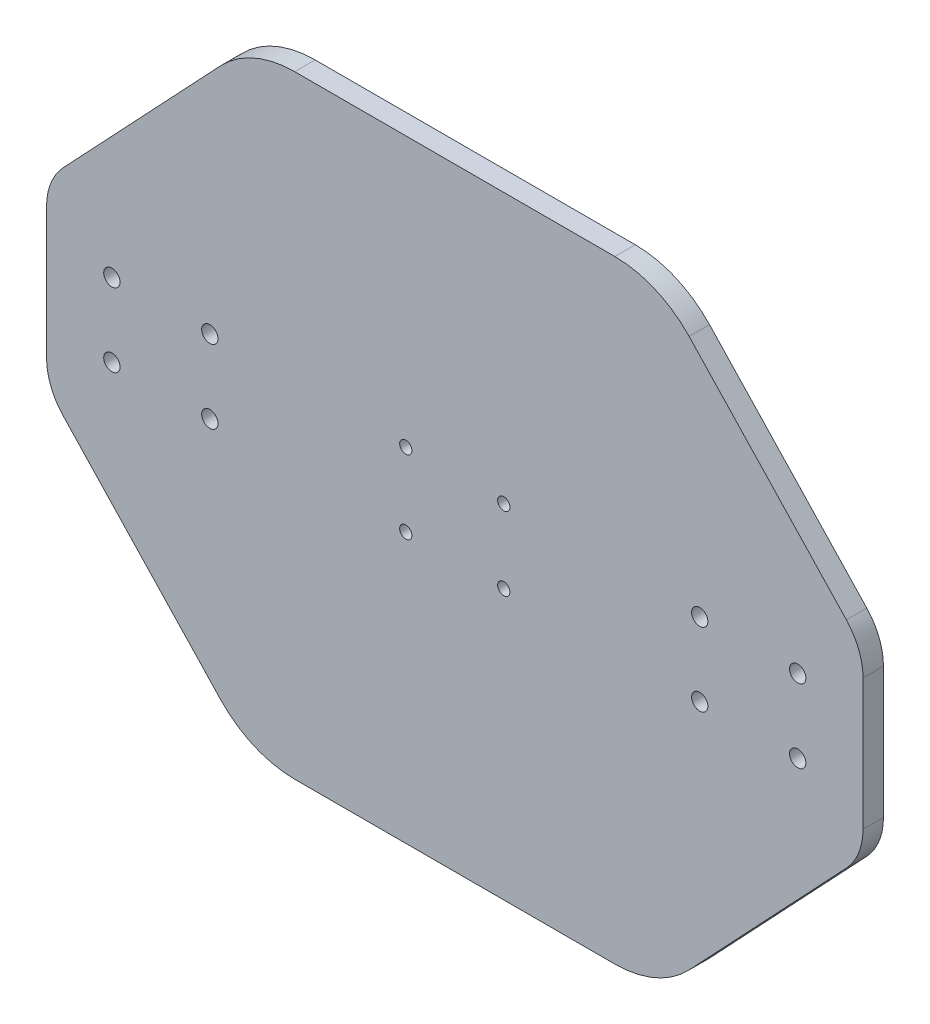
ISO-10303-21;
HEADER;
FILE_DESCRIPTION(('STEP AP214'),'2;1');
FILE_NAME('part.step','',(''),(''),'','','');
FILE_SCHEMA(('AUTOMOTIVE_DESIGN { 1 0 10303 214 1 1 1 1 }'));
ENDSEC;
DATA;
#1=APPLICATION_CONTEXT('core data for automotive mechanical design processes');
#2=APPLICATION_PROTOCOL_DEFINITION('international standard','automotive_design',2000,#1);
#3=PRODUCT_CONTEXT('',#1,'mechanical');
#4=PRODUCT('Part','Part','',(#3));
#5=PRODUCT_RELATED_PRODUCT_CATEGORY('part','',(#4));
#6=PRODUCT_DEFINITION_FORMATION('','',#4);
#7=PRODUCT_DEFINITION_CONTEXT('part definition',#1,'design');
#8=PRODUCT_DEFINITION('design','',#6,#7);
#9=PRODUCT_DEFINITION_SHAPE('','',#8);
#10=(LENGTH_UNIT() NAMED_UNIT(*) SI_UNIT(.MILLI.,.METRE.));
#11=(NAMED_UNIT(*) PLANE_ANGLE_UNIT() SI_UNIT($,.RADIAN.));
#12=(NAMED_UNIT(*) SI_UNIT($,.STERADIAN.) SOLID_ANGLE_UNIT());
#13=UNCERTAINTY_MEASURE_WITH_UNIT(LENGTH_MEASURE(1.E-05),#10,'distance_accuracy_value','');
#14=(GEOMETRIC_REPRESENTATION_CONTEXT(3) GLOBAL_UNCERTAINTY_ASSIGNED_CONTEXT((#13)) GLOBAL_UNIT_ASSIGNED_CONTEXT((#10,
#11,#12)) REPRESENTATION_CONTEXT('',''));
#15=CARTESIAN_POINT('',(0.,0.,0.));
#16=DIRECTION('',(0.,0.,1.));
#17=DIRECTION('',(1.,0.,0.));
#18=AXIS2_PLACEMENT_3D('',#15,#16,#17);
#19=CARTESIAN_POINT('',(200.,-69.40115510375,5.));
#20=DIRECTION('',(-1.,0.,0.));
#21=DIRECTION('',(0.,0.,1.));
#22=AXIS2_PLACEMENT_3D('',#19,#20,#21);
#23=PLANE('',#22);
#24=DIRECTION('',(0.,0.,-1.));
#25=VECTOR('',#24,1.);
#26=CARTESIAN_POINT('',(200.,-10.3963762982842,400.));
#27=LINE('',#26,#25);
#28=CARTESIAN_POINT('',(200.,-10.3963762982842,5.));
#29=VERTEX_POINT('',#28);
#30=CARTESIAN_POINT('',(200.,-10.3963762982842,0.));
#31=VERTEX_POINT('',#30);
#32=EDGE_CURVE('E212',#29,#31,#27,.T.);
#33=ORIENTED_EDGE('',*,*,#32,.T.);
#34=DIRECTION('',(0.,1.,0.));
#35=VECTOR('',#34,1.);
#36=CARTESIAN_POINT('',(200.,-69.40115510375,0.));
#37=LINE('',#36,#35);
#38=CARTESIAN_POINT('',(200.,21.6940660907842,0.));
#39=VERTEX_POINT('',#38);
#40=EDGE_CURVE('E310',#31,#39,#37,.T.);
#41=ORIENTED_EDGE('',*,*,#40,.T.);
#42=DIRECTION('',(0.,0.,-1.));
#43=VECTOR('',#42,1.);
#44=CARTESIAN_POINT('',(200.,21.6940660907842,400.));
#45=LINE('',#44,#43);
#46=CARTESIAN_POINT('',(200.,21.6940660907842,5.));
#47=VERTEX_POINT('',#46);
#48=EDGE_CURVE('E229',#47,#39,#45,.T.);
#49=ORIENTED_EDGE('',*,*,#48,.F.);
#50=DIRECTION('',(0.,1.,0.));
#51=VECTOR('',#50,1.);
#52=CARTESIAN_POINT('',(200.,-69.40115510375,5.));
#53=LINE('',#52,#51);
#54=EDGE_CURVE('E301',#29,#47,#53,.T.);
#55=ORIENTED_EDGE('',*,*,#54,.F.);
#56=EDGE_LOOP('',(#33,#41,#49,#55));
#57=FACE_BOUND('',#56,.T.);
#58=ADVANCED_FACE('F38',(#57),#23,.F.);
#59=CARTESIAN_POINT('',(200.,80.69884489625,5.));
#60=DIRECTION('',(0.,-1.,0.));
#61=DIRECTION('',(0.,0.,-1.));
#62=AXIS2_PLACEMENT_3D('',#59,#60,#61);
#63=PLANE('',#62);
#64=DIRECTION('',(0.,0.,-1.));
#65=VECTOR('',#64,1.);
#66=CARTESIAN_POINT('',(60.7913584754412,80.69884489625,400.));
#67=LINE('',#66,#65);
#68=CARTESIAN_POINT('',(60.7913584754412,80.69884489625,5.));
#69=VERTEX_POINT('',#68);
#70=CARTESIAN_POINT('',(60.7913584754412,80.69884489625,0.));
#71=VERTEX_POINT('',#70);
#72=EDGE_CURVE('E185',#69,#71,#67,.T.);
#73=ORIENTED_EDGE('',*,*,#72,.F.);
#74=DIRECTION('',(-1.,0.,0.));
#75=VECTOR('',#74,1.);
#76=CARTESIAN_POINT('',(200.,80.69884489625,5.));
#77=LINE('',#76,#75);
#78=CARTESIAN_POINT('',(139.208641524559,80.69884489625,5.));
#79=VERTEX_POINT('',#78);
#80=EDGE_CURVE('E304',#79,#69,#77,.T.);
#81=ORIENTED_EDGE('',*,*,#80,.F.);
#82=DIRECTION('',(0.,0.,-1.));
#83=VECTOR('',#82,1.);
#84=CARTESIAN_POINT('',(139.208641524559,80.69884489625,400.));
#85=LINE('',#84,#83);
#86=CARTESIAN_POINT('',(139.208641524559,80.69884489625,0.));
#87=VERTEX_POINT('',#86);
#88=EDGE_CURVE('E231',#79,#87,#85,.T.);
#89=ORIENTED_EDGE('',*,*,#88,.T.);
#90=DIRECTION('',(-1.,0.,0.));
#91=VECTOR('',#90,1.);
#92=CARTESIAN_POINT('',(200.,80.69884489625,0.));
#93=LINE('',#92,#91);
#94=EDGE_CURVE('E313',#87,#71,#93,.T.);
#95=ORIENTED_EDGE('',*,*,#94,.T.);
#96=EDGE_LOOP('',(#73,#81,#89,#95));
#97=FACE_BOUND('',#96,.T.);
#98=ADVANCED_FACE('F372',(#97),#63,.F.);
#99=CARTESIAN_POINT('',(0.,-69.40115510375,5.));
#100=DIRECTION('',(1.,0.,0.));
#101=DIRECTION('',(0.,0.,-1.));
#102=AXIS2_PLACEMENT_3D('',#99,#100,#101);
#103=PLANE('',#102);
#104=DIRECTION('',(0.,0.,-1.));
#105=VECTOR('',#104,1.);
#106=CARTESIAN_POINT('',(0.,-10.3963762982842,400.));
#107=LINE('',#106,#105);
#108=CARTESIAN_POINT('',(0.,-10.3963762982842,5.));
#109=VERTEX_POINT('',#108);
#110=CARTESIAN_POINT('',(0.,-10.3963762982842,0.));
#111=VERTEX_POINT('',#110);
#112=EDGE_CURVE('E198',#109,#111,#107,.T.);
#113=ORIENTED_EDGE('',*,*,#112,.F.);
#114=DIRECTION('',(0.,-1.,0.));
#115=VECTOR('',#114,1.);
#116=CARTESIAN_POINT('',(0.,-69.40115510375,5.));
#117=LINE('',#116,#115);
#118=CARTESIAN_POINT('',(0.,21.6940660907842,5.));
#119=VERTEX_POINT('',#118);
#120=EDGE_CURVE('E46',#119,#109,#117,.T.);
#121=ORIENTED_EDGE('',*,*,#120,.F.);
#122=DIRECTION('',(0.,0.,-1.));
#123=VECTOR('',#122,1.);
#124=CARTESIAN_POINT('',(0.,21.6940660907842,400.));
#125=LINE('',#124,#123);
#126=CARTESIAN_POINT('',(0.,21.6940660907842,0.));
#127=VERTEX_POINT('',#126);
#128=EDGE_CURVE('E163',#119,#127,#125,.T.);
#129=ORIENTED_EDGE('',*,*,#128,.T.);
#130=DIRECTION('',(0.,-1.,0.));
#131=VECTOR('',#130,1.);
#132=CARTESIAN_POINT('',(0.,-69.40115510375,0.));
#133=LINE('',#132,#131);
#134=EDGE_CURVE('E180',#127,#111,#133,.T.);
#135=ORIENTED_EDGE('',*,*,#134,.T.);
#136=EDGE_LOOP('',(#113,#121,#129,#135));
#137=FACE_BOUND('',#136,.T.);
#138=ADVANCED_FACE('F377',(#137),#103,.F.);
#139=CARTESIAN_POINT('',(200.,-69.40115510375,5.));
#140=DIRECTION('',(0.,1.,0.));
#141=DIRECTION('',(0.,0.,1.));
#142=AXIS2_PLACEMENT_3D('',#139,#140,#141);
#143=PLANE('',#142);
#144=DIRECTION('',(0.,0.,-1.));
#145=VECTOR('',#144,1.);
#146=CARTESIAN_POINT('',(139.208641524559,-69.40115510375,400.));
#147=LINE('',#146,#145);
#148=CARTESIAN_POINT('',(139.208641524559,-69.40115510375,5.));
#149=VERTEX_POINT('',#148);
#150=CARTESIAN_POINT('',(139.208641524559,-69.40115510375,0.));
#151=VERTEX_POINT('',#150);
#152=EDGE_CURVE('E191',#149,#151,#147,.T.);
#153=ORIENTED_EDGE('',*,*,#152,.F.);
#154=DIRECTION('',(1.,0.,0.));
#155=VECTOR('',#154,1.);
#156=CARTESIAN_POINT('',(200.,-69.40115510375,5.));
#157=LINE('',#156,#155);
#158=CARTESIAN_POINT('',(60.791358475441,-69.40115510375,5.));
#159=VERTEX_POINT('',#158);
#160=EDGE_CURVE('E12',#159,#149,#157,.T.);
#161=ORIENTED_EDGE('',*,*,#160,.F.);
#162=DIRECTION('',(0.,0.,-1.));
#163=VECTOR('',#162,1.);
#164=CARTESIAN_POINT('',(60.791358475441,-69.40115510375,400.));
#165=LINE('',#164,#163);
#166=CARTESIAN_POINT('',(60.791358475441,-69.40115510375,0.));
#167=VERTEX_POINT('',#166);
#168=EDGE_CURVE('E200',#159,#167,#165,.T.);
#169=ORIENTED_EDGE('',*,*,#168,.T.);
#170=DIRECTION('',(1.,0.,0.));
#171=VECTOR('',#170,1.);
#172=CARTESIAN_POINT('',(200.,-69.40115510375,0.));
#173=LINE('',#172,#171);
#174=EDGE_CURVE('E305',#167,#151,#173,.T.);
#175=ORIENTED_EDGE('',*,*,#174,.T.);
#176=EDGE_LOOP('',(#153,#161,#169,#175));
#177=FACE_BOUND('',#176,.T.);
#178=ADVANCED_FACE('F401',(#177),#143,.F.);
#179=CARTESIAN_POINT('',(0.,0.,5.));
#180=DIRECTION('',(0.,0.,1.));
#181=DIRECTION('',(1.,0.,0.));
#182=AXIS2_PLACEMENT_3D('',#179,#180,#181);
#183=PLANE('',#182);
#184=CARTESIAN_POINT('',(40.,14.64884489625,5.));
#185=DIRECTION('',(0.,0.,1.));
#186=DIRECTION('',(-1.,0.,0.));
#187=AXIS2_PLACEMENT_3D('',#184,#185,#186);
#188=CIRCLE('',#187,2.);
#189=CARTESIAN_POINT('',(38.,14.64884489625,5.));
#190=VERTEX_POINT('',#189);
#191=EDGE_CURVE('E280',#190,#190,#188,.T.);
#192=ORIENTED_EDGE('',*,*,#191,.F.);
#193=EDGE_LOOP('',(#192));
#194=FACE_BOUND('',#193,.T.);
#195=CARTESIAN_POINT('',(40.,-3.35115510374999,5.));
#196=DIRECTION('',(0.,0.,1.));
#197=DIRECTION('',(1.,0.,0.));
#198=AXIS2_PLACEMENT_3D('',#195,#196,#197);
#199=CIRCLE('',#198,2.);
#200=CARTESIAN_POINT('',(42.,-3.35115510374999,5.));
#201=VERTEX_POINT('',#200);
#202=EDGE_CURVE('E277',#201,#201,#199,.T.);
#203=ORIENTED_EDGE('',*,*,#202,.F.);
#204=EDGE_LOOP('',(#203));
#205=FACE_BOUND('',#204,.T.);
#206=CARTESIAN_POINT('',(16.,-3.35115510374999,5.));
#207=DIRECTION('',(0.,0.,1.));
#208=DIRECTION('',(-1.,0.,0.));
#209=AXIS2_PLACEMENT_3D('',#206,#207,#208);
#210=CIRCLE('',#209,2.);
#211=CARTESIAN_POINT('',(14.,-3.35115510374999,5.));
#212=VERTEX_POINT('',#211);
#213=EDGE_CURVE('E274',#212,#212,#210,.T.);
#214=ORIENTED_EDGE('',*,*,#213,.F.);
#215=EDGE_LOOP('',(#214));
#216=FACE_BOUND('',#215,.T.);
#217=CARTESIAN_POINT('',(184.,-3.35115510374997,5.));
#218=DIRECTION('',(0.,0.,1.));
#219=DIRECTION('',(1.,0.,0.));
#220=AXIS2_PLACEMENT_3D('',#217,#218,#219);
#221=CIRCLE('',#220,2.);
#222=CARTESIAN_POINT('',(186.,-3.35115510374997,5.));
#223=VERTEX_POINT('',#222);
#224=EDGE_CURVE('E268',#223,#223,#221,.T.);
#225=ORIENTED_EDGE('',*,*,#224,.F.);
#226=EDGE_LOOP('',(#225));
#227=FACE_BOUND('',#226,.T.);
#228=CARTESIAN_POINT('',(112.,-3.35115510374998,5.));
#229=DIRECTION('',(0.,0.,1.));
#230=DIRECTION('',(1.,0.,0.));
#231=AXIS2_PLACEMENT_3D('',#228,#229,#230);
#232=CIRCLE('',#231,1.5);
#233=CARTESIAN_POINT('',(113.5,-3.35115510374998,5.));
#234=VERTEX_POINT('',#233);
#235=EDGE_CURVE('E283',#234,#234,#232,.T.);
#236=ORIENTED_EDGE('',*,*,#235,.F.);
#237=EDGE_LOOP('',(#236));
#238=FACE_BOUND('',#237,.T.);
#239=CARTESIAN_POINT('',(88.,-3.35115510374998,5.));
#240=DIRECTION('',(0.,0.,1.));
#241=DIRECTION('',(-1.,0.,0.));
#242=AXIS2_PLACEMENT_3D('',#239,#240,#241);
#243=CIRCLE('',#242,1.5);
#244=CARTESIAN_POINT('',(86.5,-3.35115510374998,5.));
#245=VERTEX_POINT('',#244);
#246=EDGE_CURVE('E293',#245,#245,#243,.T.);
#247=ORIENTED_EDGE('',*,*,#246,.F.);
#248=EDGE_LOOP('',(#247));
#249=FACE_BOUND('',#248,.T.);
#250=CARTESIAN_POINT('',(112.,14.64884489625,5.));
#251=DIRECTION('',(0.,0.,1.));
#252=DIRECTION('',(-1.,0.,0.));
#253=AXIS2_PLACEMENT_3D('',#250,#251,#252);
#254=CIRCLE('',#253,1.5);
#255=CARTESIAN_POINT('',(110.5,14.64884489625,5.));
#256=VERTEX_POINT('',#255);
#257=EDGE_CURVE('E290',#256,#256,#254,.T.);
#258=ORIENTED_EDGE('',*,*,#257,.F.);
#259=EDGE_LOOP('',(#258));
#260=FACE_BOUND('',#259,.T.);
#261=CARTESIAN_POINT('',(16.,14.64884489625,5.));
#262=DIRECTION('',(0.,0.,1.));
#263=DIRECTION('',(1.,0.,0.));
#264=AXIS2_PLACEMENT_3D('',#261,#262,#263);
#265=CIRCLE('',#264,2.);
#266=CARTESIAN_POINT('',(18.,14.64884489625,5.));
#267=VERTEX_POINT('',#266);
#268=EDGE_CURVE('E286',#267,#267,#265,.T.);
#269=ORIENTED_EDGE('',*,*,#268,.F.);
#270=EDGE_LOOP('',(#269));
#271=FACE_BOUND('',#270,.T.);
#272=CARTESIAN_POINT('',(160.,-3.35115510374998,5.));
#273=DIRECTION('',(0.,0.,1.));
#274=DIRECTION('',(-1.,0.,0.));
#275=AXIS2_PLACEMENT_3D('',#272,#273,#274);
#276=CIRCLE('',#275,2.);
#277=CARTESIAN_POINT('',(158.,-3.35115510374998,5.));
#278=VERTEX_POINT('',#277);
#279=EDGE_CURVE('E265',#278,#278,#276,.T.);
#280=ORIENTED_EDGE('',*,*,#279,.F.);
#281=EDGE_LOOP('',(#280));
#282=FACE_BOUND('',#281,.T.);
#283=CARTESIAN_POINT('',(160.,14.64884489625,5.));
#284=DIRECTION('',(0.,0.,1.));
#285=DIRECTION('',(1.,0.,0.));
#286=AXIS2_PLACEMENT_3D('',#283,#284,#285);
#287=CIRCLE('',#286,2.);
#288=CARTESIAN_POINT('',(162.,14.64884489625,5.));
#289=VERTEX_POINT('',#288);
#290=EDGE_CURVE('E269',#289,#289,#287,.T.);
#291=ORIENTED_EDGE('',*,*,#290,.F.);
#292=EDGE_LOOP('',(#291));
#293=FACE_BOUND('',#292,.T.);
#294=CARTESIAN_POINT('',(184.,14.64884489625,5.));
#295=DIRECTION('',(0.,0.,1.));
#296=DIRECTION('',(-1.,0.,0.));
#297=AXIS2_PLACEMENT_3D('',#294,#295,#296);
#298=CIRCLE('',#297,2.);
#299=CARTESIAN_POINT('',(182.,14.64884489625,5.));
#300=VERTEX_POINT('',#299);
#301=EDGE_CURVE('E264',#300,#300,#298,.T.);
#302=ORIENTED_EDGE('',*,*,#301,.F.);
#303=EDGE_LOOP('',(#302));
#304=FACE_BOUND('',#303,.T.);
#305=CARTESIAN_POINT('',(88.,14.64884489625,5.));
#306=DIRECTION('',(0.,0.,1.));
#307=DIRECTION('',(1.,0.,0.));
#308=AXIS2_PLACEMENT_3D('',#305,#306,#307);
#309=CIRCLE('',#308,1.5);
#310=CARTESIAN_POINT('',(89.5,14.64884489625,5.));
#311=VERTEX_POINT('',#310);
#312=EDGE_CURVE('E289',#311,#311,#309,.T.);
#313=ORIENTED_EDGE('',*,*,#312,.F.);
#314=EDGE_LOOP('',(#313));
#315=FACE_BOUND('',#314,.T.);
#316=ORIENTED_EDGE('',*,*,#160,.T.);
#317=CARTESIAN_POINT('',(139.208641524559,-44.40115510375,5.));
#318=DIRECTION('',(0.,0.,1.));
#319=DIRECTION('',(1.,0.,0.));
#320=AXIS2_PLACEMENT_3D('',#317,#318,#319);
#321=CIRCLE('',#320,25.);
#322=CARTESIAN_POINT('',(157.401555295619,-61.5481049350979,5.));
#323=VERTEX_POINT('',#322);
#324=EDGE_CURVE('E261',#149,#323,#321,.T.);
#325=ORIENTED_EDGE('',*,*,#324,.T.);
#326=DIRECTION('',(-0.685877993253921,-0.72771655084241,0.));
#327=VECTOR('',#326,1.);
#328=CARTESIAN_POINT('',(114.075542164319,-107.517004867407,5.));
#329=LINE('',#328,#327);
#330=CARTESIAN_POINT('',(195.915748262636,-20.6845461970931,5.));
#331=VERTEX_POINT('',#330);
#332=EDGE_CURVE('E257',#331,#323,#329,.T.);
#333=ORIENTED_EDGE('',*,*,#332,.F.);
#334=CARTESIAN_POINT('',(185.,-10.3963762982842,5.));
#335=DIRECTION('',(0.,0.,1.));
#336=DIRECTION('',(1.,0.,0.));
#337=AXIS2_PLACEMENT_3D('',#334,#335,#336);
#338=CIRCLE('',#337,15.);
#339=EDGE_CURVE('E259',#29,#331,#338,.F.);
#340=ORIENTED_EDGE('',*,*,#339,.F.);
#341=ORIENTED_EDGE('',*,*,#54,.T.);
#342=CARTESIAN_POINT('',(185.,21.6940660907842,5.));
#343=DIRECTION('',(0.,0.,1.));
#344=DIRECTION('',(1.,0.,0.));
#345=AXIS2_PLACEMENT_3D('',#342,#343,#344);
#346=CIRCLE('',#345,15.);
#347=CARTESIAN_POINT('',(195.915748262636,31.9822359895931,5.));
#348=VERTEX_POINT('',#347);
#349=EDGE_CURVE('E237',#47,#348,#346,.T.);
#350=ORIENTED_EDGE('',*,*,#349,.T.);
#351=DIRECTION('',(-0.685877993253921,0.72771655084241,0.));
#352=VECTOR('',#351,1.);
#353=CARTESIAN_POINT('',(119.714498955847,112.831761504097,5.));
#354=LINE('',#353,#352);
#355=CARTESIAN_POINT('',(157.401555295619,72.8457947275979,5.));
#356=VERTEX_POINT('',#355);
#357=EDGE_CURVE('E240',#348,#356,#354,.T.);
#358=ORIENTED_EDGE('',*,*,#357,.T.);
#359=CARTESIAN_POINT('',(139.208641524559,55.69884489625,5.));
#360=DIRECTION('',(0.,0.,1.));
#361=DIRECTION('',(1.,0.,0.));
#362=AXIS2_PLACEMENT_3D('',#359,#360,#361);
#363=CIRCLE('',#362,25.);
#364=EDGE_CURVE('E228',#79,#356,#363,.F.);
#365=ORIENTED_EDGE('',*,*,#364,.F.);
#366=ORIENTED_EDGE('',*,*,#80,.T.);
#367=CARTESIAN_POINT('',(60.791358475441,55.69884489625,5.));
#368=DIRECTION('',(0.,0.,1.));
#369=DIRECTION('',(1.,0.,0.));
#370=AXIS2_PLACEMENT_3D('',#367,#368,#369);
#371=CIRCLE('',#370,25.);
#372=CARTESIAN_POINT('',(42.5984447043807,72.8457947275979,5.));
#373=VERTEX_POINT('',#372);
#374=EDGE_CURVE('E246',#69,#373,#371,.T.);
#375=ORIENTED_EDGE('',*,*,#374,.T.);
#376=DIRECTION('',(0.685877993253921,0.72771655084241,0.));
#377=VECTOR('',#376,1.);
#378=CARTESIAN_POINT('',(-13.8002232818518,13.0068079942053,5.));
#379=LINE('',#378,#377);
#380=CARTESIAN_POINT('',(4.08425173736389,31.9822359895931,5.));
#381=VERTEX_POINT('',#380);
#382=EDGE_CURVE('E243',#381,#373,#379,.T.);
#383=ORIENTED_EDGE('',*,*,#382,.F.);
#384=CARTESIAN_POINT('',(15.,21.6940660907842,5.));
#385=DIRECTION('',(0.,0.,1.));
#386=DIRECTION('',(1.,0.,0.));
#387=AXIS2_PLACEMENT_3D('',#384,#385,#386);
#388=CIRCLE('',#387,15.);
#389=EDGE_CURVE('E160',#119,#381,#388,.F.);
#390=ORIENTED_EDGE('',*,*,#389,.F.);
#391=ORIENTED_EDGE('',*,*,#120,.T.);
#392=CARTESIAN_POINT('',(15.,-10.3963762982842,5.));
#393=DIRECTION('',(0.,0.,1.));
#394=DIRECTION('',(1.,0.,0.));
#395=AXIS2_PLACEMENT_3D('',#392,#393,#394);
#396=CIRCLE('',#395,15.);
#397=CARTESIAN_POINT('',(4.08425173736389,-20.6845461970931,5.));
#398=VERTEX_POINT('',#397);
#399=EDGE_CURVE('E251',#109,#398,#396,.T.);
#400=ORIENTED_EDGE('',*,*,#399,.T.);
#401=DIRECTION('',(0.685877993253921,-0.72771655084241,0.));
#402=VECTOR('',#401,1.);
#403=CARTESIAN_POINT('',(-8.16126649032434,-7.69205135751587,5.));
#404=LINE('',#403,#402);
#405=CARTESIAN_POINT('',(42.5984447043807,-61.5481049350979,5.));
#406=VERTEX_POINT('',#405);
#407=EDGE_CURVE('E254',#398,#406,#404,.T.);
#408=ORIENTED_EDGE('',*,*,#407,.T.);
#409=CARTESIAN_POINT('',(60.791358475441,-44.40115510375,5.));
#410=DIRECTION('',(0.,0.,1.));
#411=DIRECTION('',(1.,0.,0.));
#412=AXIS2_PLACEMENT_3D('',#409,#410,#411);
#413=CIRCLE('',#412,25.);
#414=EDGE_CURVE('E249',#159,#406,#413,.F.);
#415=ORIENTED_EDGE('',*,*,#414,.F.);
#416=EDGE_LOOP('',(#316,#325,#333,#340,#341,#350,#358,#365,#366,#375,#383,#390,#391,#400,#408,#415));
#417=FACE_BOUND('',#416,.T.);
#418=ADVANCED_FACE('F391',(#194,#205,#216,#227,#238,#249,#260,#271,#282,#293,#304,#315,#417),
#183,.T.);
#419=CARTESIAN_POINT('',(0.,0.,0.));
#420=DIRECTION('',(0.,0.,1.));
#421=DIRECTION('',(1.,0.,0.));
#422=AXIS2_PLACEMENT_3D('',#419,#420,#421);
#423=PLANE('',#422);
#424=CARTESIAN_POINT('',(139.208641524559,-44.40115510375,0.));
#425=DIRECTION('',(0.,0.,-1.));
#426=DIRECTION('',(-1.,0.,0.));
#427=AXIS2_PLACEMENT_3D('',#424,#425,#426);
#428=CIRCLE('',#427,25.);
#429=CARTESIAN_POINT('',(157.401555295619,-61.5481049350979,0.));
#430=VERTEX_POINT('',#429);
#431=EDGE_CURVE('E54',#430,#151,#428,.T.);
#432=ORIENTED_EDGE('',*,*,#431,.T.);
#433=ORIENTED_EDGE('',*,*,#174,.F.);
#434=CARTESIAN_POINT('',(60.791358475441,-44.40115510375,0.));
#435=DIRECTION('',(0.,0.,-1.));
#436=DIRECTION('',(-1.,0.,0.));
#437=AXIS2_PLACEMENT_3D('',#434,#435,#436);
#438=CIRCLE('',#437,25.);
#439=CARTESIAN_POINT('',(42.5984447043807,-61.5481049350979,0.));
#440=VERTEX_POINT('',#439);
#441=EDGE_CURVE('E190',#440,#167,#438,.F.);
#442=ORIENTED_EDGE('',*,*,#441,.F.);
#443=DIRECTION('',(-0.685877993253921,0.72771655084241,0.));
#444=VECTOR('',#443,1.);
#445=CARTESIAN_POINT('',(-8.16126649032434,-7.69205135751587,0.));
#446=LINE('',#445,#444);
#447=CARTESIAN_POINT('',(4.08425173736389,-20.6845461970931,0.));
#448=VERTEX_POINT('',#447);
#449=EDGE_CURVE('E62',#440,#448,#446,.T.);
#450=ORIENTED_EDGE('',*,*,#449,.T.);
#451=CARTESIAN_POINT('',(15.,-10.3963762982842,0.));
#452=DIRECTION('',(0.,0.,-1.));
#453=DIRECTION('',(-1.,0.,0.));
#454=AXIS2_PLACEMENT_3D('',#451,#452,#453);
#455=CIRCLE('',#454,15.);
#456=EDGE_CURVE('E193',#448,#111,#455,.T.);
#457=ORIENTED_EDGE('',*,*,#456,.T.);
#458=ORIENTED_EDGE('',*,*,#134,.F.);
#459=CARTESIAN_POINT('',(15.,21.6940660907842,0.));
#460=DIRECTION('',(0.,0.,-1.));
#461=DIRECTION('',(-1.,0.,0.));
#462=AXIS2_PLACEMENT_3D('',#459,#460,#461);
#463=CIRCLE('',#462,15.);
#464=CARTESIAN_POINT('',(4.08425173736389,31.9822359895931,0.));
#465=VERTEX_POINT('',#464);
#466=EDGE_CURVE('E157',#465,#127,#463,.F.);
#467=ORIENTED_EDGE('',*,*,#466,.F.);
#468=DIRECTION('',(-0.685877993253921,-0.72771655084241,0.));
#469=VECTOR('',#468,1.);
#470=CARTESIAN_POINT('',(-13.8002232818518,13.0068079942053,0.));
#471=LINE('',#470,#469);
#472=CARTESIAN_POINT('',(42.5984447043807,72.8457947275979,0.));
#473=VERTEX_POINT('',#472);
#474=EDGE_CURVE('E168',#473,#465,#471,.T.);
#475=ORIENTED_EDGE('',*,*,#474,.F.);
#476=CARTESIAN_POINT('',(60.791358475441,55.69884489625,0.));
#477=DIRECTION('',(0.,0.,-1.));
#478=DIRECTION('',(-1.,0.,0.));
#479=AXIS2_PLACEMENT_3D('',#476,#477,#478);
#480=CIRCLE('',#479,25.);
#481=EDGE_CURVE('E173',#473,#71,#480,.T.);
#482=ORIENTED_EDGE('',*,*,#481,.T.);
#483=ORIENTED_EDGE('',*,*,#94,.F.);
#484=CARTESIAN_POINT('',(139.208641524559,55.69884489625,0.));
#485=DIRECTION('',(0.,0.,-1.));
#486=DIRECTION('',(-1.,0.,0.));
#487=AXIS2_PLACEMENT_3D('',#484,#485,#486);
#488=CIRCLE('',#487,25.);
#489=CARTESIAN_POINT('',(157.401555295619,72.8457947275979,0.));
#490=VERTEX_POINT('',#489);
#491=EDGE_CURVE('E220',#490,#87,#488,.F.);
#492=ORIENTED_EDGE('',*,*,#491,.F.);
#493=DIRECTION('',(0.685877993253921,-0.72771655084241,0.));
#494=VECTOR('',#493,1.);
#495=CARTESIAN_POINT('',(119.714498955847,112.831761504097,0.));
#496=LINE('',#495,#494);
#497=CARTESIAN_POINT('',(195.915748262636,31.9822359895931,0.));
#498=VERTEX_POINT('',#497);
#499=EDGE_CURVE('E187',#490,#498,#496,.T.);
#500=ORIENTED_EDGE('',*,*,#499,.T.);
#501=CARTESIAN_POINT('',(185.,21.6940660907842,0.));
#502=DIRECTION('',(0.,0.,-1.));
#503=DIRECTION('',(-1.,0.,0.));
#504=AXIS2_PLACEMENT_3D('',#501,#502,#503);
#505=CIRCLE('',#504,15.);
#506=EDGE_CURVE('E222',#498,#39,#505,.T.);
#507=ORIENTED_EDGE('',*,*,#506,.T.);
#508=ORIENTED_EDGE('',*,*,#40,.F.);
#509=CARTESIAN_POINT('',(185.,-10.3963762982842,0.));
#510=DIRECTION('',(0.,0.,-1.));
#511=DIRECTION('',(-1.,0.,0.));
#512=AXIS2_PLACEMENT_3D('',#509,#510,#511);
#513=CIRCLE('',#512,15.);
#514=CARTESIAN_POINT('',(195.915748262636,-20.6845461970931,0.));
#515=VERTEX_POINT('',#514);
#516=EDGE_CURVE('E208',#515,#31,#513,.F.);
#517=ORIENTED_EDGE('',*,*,#516,.F.);
#518=DIRECTION('',(0.685877993253921,0.72771655084241,0.));
#519=VECTOR('',#518,1.);
#520=CARTESIAN_POINT('',(114.075542164319,-107.517004867407,0.));
#521=LINE('',#520,#519);
#522=EDGE_CURVE('E205',#430,#515,#521,.T.);
#523=ORIENTED_EDGE('',*,*,#522,.F.);
#524=EDGE_LOOP('',(#432,#433,#442,#450,#457,#458,#467,#475,#482,#483,#492,#500,#507,#508,#517,#523));
#525=FACE_BOUND('',#524,.T.);
#526=CARTESIAN_POINT('',(40.,14.64884489625,0.));
#527=DIRECTION('',(0.,0.,1.));
#528=DIRECTION('',(1.,0.,0.));
#529=AXIS2_PLACEMENT_3D('',#526,#527,#528);
#530=CIRCLE('',#529,2.);
#531=CARTESIAN_POINT('',(42.,14.64884489625,0.));
#532=VERTEX_POINT('',#531);
#533=EDGE_CURVE('E41',#532,#532,#530,.T.);
#534=ORIENTED_EDGE('',*,*,#533,.T.);
#535=EDGE_LOOP('',(#534));
#536=FACE_BOUND('',#535,.T.);
#537=CARTESIAN_POINT('',(40.,-3.35115510374999,0.));
#538=DIRECTION('',(0.,0.,1.));
#539=DIRECTION('',(1.,0.,0.));
#540=AXIS2_PLACEMENT_3D('',#537,#538,#539);
#541=CIRCLE('',#540,2.);
#542=CARTESIAN_POINT('',(42.,-3.35115510374999,0.));
#543=VERTEX_POINT('',#542);
#544=EDGE_CURVE('E347',#543,#543,#541,.T.);
#545=ORIENTED_EDGE('',*,*,#544,.T.);
#546=EDGE_LOOP('',(#545));
#547=FACE_BOUND('',#546,.T.);
#548=CARTESIAN_POINT('',(16.,-3.35115510374999,0.));
#549=DIRECTION('',(0.,0.,1.));
#550=DIRECTION('',(1.,0.,0.));
#551=AXIS2_PLACEMENT_3D('',#548,#549,#550);
#552=CIRCLE('',#551,2.);
#553=CARTESIAN_POINT('',(18.,-3.35115510374999,0.));
#554=VERTEX_POINT('',#553);
#555=EDGE_CURVE('E345',#554,#554,#552,.T.);
#556=ORIENTED_EDGE('',*,*,#555,.T.);
#557=EDGE_LOOP('',(#556));
#558=FACE_BOUND('',#557,.T.);
#559=CARTESIAN_POINT('',(184.,-3.35115510374997,0.));
#560=DIRECTION('',(0.,0.,1.));
#561=DIRECTION('',(1.,0.,0.));
#562=AXIS2_PLACEMENT_3D('',#559,#560,#561);
#563=CIRCLE('',#562,2.);
#564=CARTESIAN_POINT('',(186.,-3.35115510374997,0.));
#565=VERTEX_POINT('',#564);
#566=EDGE_CURVE('E342',#565,#565,#563,.T.);
#567=ORIENTED_EDGE('',*,*,#566,.T.);
#568=EDGE_LOOP('',(#567));
#569=FACE_BOUND('',#568,.T.);
#570=CARTESIAN_POINT('',(112.,-3.35115510374998,0.));
#571=DIRECTION('',(0.,0.,1.));
#572=DIRECTION('',(1.,0.,0.));
#573=AXIS2_PLACEMENT_3D('',#570,#571,#572);
#574=CIRCLE('',#573,1.5);
#575=CARTESIAN_POINT('',(113.5,-3.35115510374998,0.));
#576=VERTEX_POINT('',#575);
#577=EDGE_CURVE('E339',#576,#576,#574,.T.);
#578=ORIENTED_EDGE('',*,*,#577,.T.);
#579=EDGE_LOOP('',(#578));
#580=FACE_BOUND('',#579,.T.);
#581=CARTESIAN_POINT('',(88.,-3.35115510374998,0.));
#582=DIRECTION('',(0.,0.,1.));
#583=DIRECTION('',(1.,0.,0.));
#584=AXIS2_PLACEMENT_3D('',#581,#582,#583);
#585=CIRCLE('',#584,1.5);
#586=CARTESIAN_POINT('',(89.5,-3.35115510374998,0.));
#587=VERTEX_POINT('',#586);
#588=EDGE_CURVE('E336',#587,#587,#585,.T.);
#589=ORIENTED_EDGE('',*,*,#588,.T.);
#590=EDGE_LOOP('',(#589));
#591=FACE_BOUND('',#590,.T.);
#592=CARTESIAN_POINT('',(112.,14.64884489625,0.));
#593=DIRECTION('',(0.,0.,1.));
#594=DIRECTION('',(1.,0.,0.));
#595=AXIS2_PLACEMENT_3D('',#592,#593,#594);
#596=CIRCLE('',#595,1.5);
#597=CARTESIAN_POINT('',(113.5,14.64884489625,0.));
#598=VERTEX_POINT('',#597);
#599=EDGE_CURVE('E333',#598,#598,#596,.T.);
#600=ORIENTED_EDGE('',*,*,#599,.T.);
#601=EDGE_LOOP('',(#600));
#602=FACE_BOUND('',#601,.T.);
#603=CARTESIAN_POINT('',(16.,14.64884489625,0.));
#604=DIRECTION('',(0.,0.,1.));
#605=DIRECTION('',(1.,0.,0.));
#606=AXIS2_PLACEMENT_3D('',#603,#604,#605);
#607=CIRCLE('',#606,2.);
#608=CARTESIAN_POINT('',(18.,14.64884489625,0.));
#609=VERTEX_POINT('',#608);
#610=EDGE_CURVE('E330',#609,#609,#607,.T.);
#611=ORIENTED_EDGE('',*,*,#610,.T.);
#612=EDGE_LOOP('',(#611));
#613=FACE_BOUND('',#612,.T.);
#614=CARTESIAN_POINT('',(160.,-3.35115510374998,0.));
#615=DIRECTION('',(0.,0.,1.));
#616=DIRECTION('',(1.,0.,0.));
#617=AXIS2_PLACEMENT_3D('',#614,#615,#616);
#618=CIRCLE('',#617,2.);
#619=CARTESIAN_POINT('',(162.,-3.35115510374998,0.));
#620=VERTEX_POINT('',#619);
#621=EDGE_CURVE('E327',#620,#620,#618,.T.);
#622=ORIENTED_EDGE('',*,*,#621,.T.);
#623=EDGE_LOOP('',(#622));
#624=FACE_BOUND('',#623,.T.);
#625=CARTESIAN_POINT('',(160.,14.64884489625,0.));
#626=DIRECTION('',(0.,0.,1.));
#627=DIRECTION('',(1.,0.,0.));
#628=AXIS2_PLACEMENT_3D('',#625,#626,#627);
#629=CIRCLE('',#628,2.);
#630=CARTESIAN_POINT('',(162.,14.64884489625,0.));
#631=VERTEX_POINT('',#630);
#632=EDGE_CURVE('E324',#631,#631,#629,.T.);
#633=ORIENTED_EDGE('',*,*,#632,.T.);
#634=EDGE_LOOP('',(#633));
#635=FACE_BOUND('',#634,.T.);
#636=CARTESIAN_POINT('',(184.,14.64884489625,0.));
#637=DIRECTION('',(0.,0.,1.));
#638=DIRECTION('',(1.,0.,0.));
#639=AXIS2_PLACEMENT_3D('',#636,#637,#638);
#640=CIRCLE('',#639,2.);
#641=CARTESIAN_POINT('',(186.,14.64884489625,0.));
#642=VERTEX_POINT('',#641);
#643=EDGE_CURVE('E321',#642,#642,#640,.T.);
#644=ORIENTED_EDGE('',*,*,#643,.T.);
#645=EDGE_LOOP('',(#644));
#646=FACE_BOUND('',#645,.T.);
#647=CARTESIAN_POINT('',(88.,14.64884489625,0.));
#648=DIRECTION('',(0.,0.,1.));
#649=DIRECTION('',(1.,0.,0.));
#650=AXIS2_PLACEMENT_3D('',#647,#648,#649);
#651=CIRCLE('',#650,1.5);
#652=CARTESIAN_POINT('',(89.5,14.64884489625,0.));
#653=VERTEX_POINT('',#652);
#654=EDGE_CURVE('E300',#653,#653,#651,.T.);
#655=ORIENTED_EDGE('',*,*,#654,.T.);
#656=EDGE_LOOP('',(#655));
#657=FACE_BOUND('',#656,.T.);
#658=ADVANCED_FACE('F176',(#525,#536,#547,#558,#569,#580,#591,#602,#613,#624,#635,#646,#657),
#423,.F.);
#659=CARTESIAN_POINT('',(88.,14.64884489625,-5.));
#660=DIRECTION('',(0.,0.,1.));
#661=DIRECTION('',(1.,0.,0.));
#662=AXIS2_PLACEMENT_3D('',#659,#660,#661);
#663=CYLINDRICAL_SURFACE('',#662,1.5);
#664=ORIENTED_EDGE('',*,*,#312,.T.);
#665=EDGE_LOOP('',(#664));
#666=FACE_BOUND('',#665,.T.);
#667=ORIENTED_EDGE('',*,*,#654,.F.);
#668=EDGE_LOOP('',(#667));
#669=FACE_BOUND('',#668,.T.);
#670=ADVANCED_FACE('F445',(#666,#669),#663,.F.);
#671=CARTESIAN_POINT('',(184.,14.64884489625,-5.));
#672=DIRECTION('',(0.,0.,1.));
#673=DIRECTION('',(1.,0.,0.));
#674=AXIS2_PLACEMENT_3D('',#671,#672,#673);
#675=CYLINDRICAL_SURFACE('',#674,2.);
#676=ORIENTED_EDGE('',*,*,#301,.T.);
#677=EDGE_LOOP('',(#676));
#678=FACE_BOUND('',#677,.T.);
#679=ORIENTED_EDGE('',*,*,#643,.F.);
#680=EDGE_LOOP('',(#679));
#681=FACE_BOUND('',#680,.T.);
#682=ADVANCED_FACE('F441',(#678,#681),#675,.F.);
#683=CARTESIAN_POINT('',(160.,14.64884489625,-5.));
#684=DIRECTION('',(0.,0.,1.));
#685=DIRECTION('',(1.,0.,0.));
#686=AXIS2_PLACEMENT_3D('',#683,#684,#685);
#687=CYLINDRICAL_SURFACE('',#686,2.);
#688=ORIENTED_EDGE('',*,*,#290,.T.);
#689=EDGE_LOOP('',(#688));
#690=FACE_BOUND('',#689,.T.);
#691=ORIENTED_EDGE('',*,*,#632,.F.);
#692=EDGE_LOOP('',(#691));
#693=FACE_BOUND('',#692,.T.);
#694=ADVANCED_FACE('F437',(#690,#693),#687,.F.);
#695=CARTESIAN_POINT('',(160.,-3.35115510374998,-5.));
#696=DIRECTION('',(0.,0.,1.));
#697=DIRECTION('',(1.,0.,0.));
#698=AXIS2_PLACEMENT_3D('',#695,#696,#697);
#699=CYLINDRICAL_SURFACE('',#698,2.);
#700=ORIENTED_EDGE('',*,*,#279,.T.);
#701=EDGE_LOOP('',(#700));
#702=FACE_BOUND('',#701,.T.);
#703=ORIENTED_EDGE('',*,*,#621,.F.);
#704=EDGE_LOOP('',(#703));
#705=FACE_BOUND('',#704,.T.);
#706=ADVANCED_FACE('F433',(#702,#705),#699,.F.);
#707=CARTESIAN_POINT('',(16.,14.64884489625,-5.));
#708=DIRECTION('',(0.,0.,1.));
#709=DIRECTION('',(1.,0.,0.));
#710=AXIS2_PLACEMENT_3D('',#707,#708,#709);
#711=CYLINDRICAL_SURFACE('',#710,2.);
#712=ORIENTED_EDGE('',*,*,#268,.T.);
#713=EDGE_LOOP('',(#712));
#714=FACE_BOUND('',#713,.T.);
#715=ORIENTED_EDGE('',*,*,#610,.F.);
#716=EDGE_LOOP('',(#715));
#717=FACE_BOUND('',#716,.T.);
#718=ADVANCED_FACE('F436',(#714,#717),#711,.F.);
#719=CARTESIAN_POINT('',(112.,14.64884489625,-5.));
#720=DIRECTION('',(0.,0.,1.));
#721=DIRECTION('',(1.,0.,0.));
#722=AXIS2_PLACEMENT_3D('',#719,#720,#721);
#723=CYLINDRICAL_SURFACE('',#722,1.5);
#724=ORIENTED_EDGE('',*,*,#257,.T.);
#725=EDGE_LOOP('',(#724));
#726=FACE_BOUND('',#725,.T.);
#727=ORIENTED_EDGE('',*,*,#599,.F.);
#728=EDGE_LOOP('',(#727));
#729=FACE_BOUND('',#728,.T.);
#730=ADVANCED_FACE('F678',(#726,#729),#723,.F.);
#731=CARTESIAN_POINT('',(88.,-3.35115510374998,-5.));
#732=DIRECTION('',(0.,0.,1.));
#733=DIRECTION('',(1.,0.,0.));
#734=AXIS2_PLACEMENT_3D('',#731,#732,#733);
#735=CYLINDRICAL_SURFACE('',#734,1.5);
#736=ORIENTED_EDGE('',*,*,#246,.T.);
#737=EDGE_LOOP('',(#736));
#738=FACE_BOUND('',#737,.T.);
#739=ORIENTED_EDGE('',*,*,#588,.F.);
#740=EDGE_LOOP('',(#739));
#741=FACE_BOUND('',#740,.T.);
#742=ADVANCED_FACE('F456',(#738,#741),#735,.F.);
#743=CARTESIAN_POINT('',(112.,-3.35115510374998,-5.));
#744=DIRECTION('',(0.,0.,1.));
#745=DIRECTION('',(1.,0.,0.));
#746=AXIS2_PLACEMENT_3D('',#743,#744,#745);
#747=CYLINDRICAL_SURFACE('',#746,1.5);
#748=ORIENTED_EDGE('',*,*,#235,.T.);
#749=EDGE_LOOP('',(#748));
#750=FACE_BOUND('',#749,.T.);
#751=ORIENTED_EDGE('',*,*,#577,.F.);
#752=EDGE_LOOP('',(#751));
#753=FACE_BOUND('',#752,.T.);
#754=ADVANCED_FACE('F451',(#750,#753),#747,.F.);
#755=CARTESIAN_POINT('',(184.,-3.35115510374997,-5.));
#756=DIRECTION('',(0.,0.,1.));
#757=DIRECTION('',(1.,0.,0.));
#758=AXIS2_PLACEMENT_3D('',#755,#756,#757);
#759=CYLINDRICAL_SURFACE('',#758,2.);
#760=ORIENTED_EDGE('',*,*,#224,.T.);
#761=EDGE_LOOP('',(#760));
#762=FACE_BOUND('',#761,.T.);
#763=ORIENTED_EDGE('',*,*,#566,.F.);
#764=EDGE_LOOP('',(#763));
#765=FACE_BOUND('',#764,.T.);
#766=ADVANCED_FACE('F448',(#762,#765),#759,.F.);
#767=CARTESIAN_POINT('',(16.,-3.35115510374999,-5.));
#768=DIRECTION('',(0.,0.,1.));
#769=DIRECTION('',(1.,0.,0.));
#770=AXIS2_PLACEMENT_3D('',#767,#768,#769);
#771=CYLINDRICAL_SURFACE('',#770,2.);
#772=ORIENTED_EDGE('',*,*,#213,.T.);
#773=EDGE_LOOP('',(#772));
#774=FACE_BOUND('',#773,.T.);
#775=ORIENTED_EDGE('',*,*,#555,.F.);
#776=EDGE_LOOP('',(#775));
#777=FACE_BOUND('',#776,.T.);
#778=ADVANCED_FACE('F367',(#774,#777),#771,.F.);
#779=CARTESIAN_POINT('',(40.,-3.35115510374999,-5.));
#780=DIRECTION('',(0.,0.,1.));
#781=DIRECTION('',(1.,0.,0.));
#782=AXIS2_PLACEMENT_3D('',#779,#780,#781);
#783=CYLINDRICAL_SURFACE('',#782,2.);
#784=ORIENTED_EDGE('',*,*,#202,.T.);
#785=EDGE_LOOP('',(#784));
#786=FACE_BOUND('',#785,.T.);
#787=ORIENTED_EDGE('',*,*,#544,.F.);
#788=EDGE_LOOP('',(#787));
#789=FACE_BOUND('',#788,.T.);
#790=ADVANCED_FACE('F357',(#786,#789),#783,.F.);
#791=CARTESIAN_POINT('',(40.,14.64884489625,-5.));
#792=DIRECTION('',(0.,0.,1.));
#793=DIRECTION('',(1.,0.,0.));
#794=AXIS2_PLACEMENT_3D('',#791,#792,#793);
#795=CYLINDRICAL_SURFACE('',#794,2.);
#796=ORIENTED_EDGE('',*,*,#191,.T.);
#797=EDGE_LOOP('',(#796));
#798=FACE_BOUND('',#797,.T.);
#799=ORIENTED_EDGE('',*,*,#533,.F.);
#800=EDGE_LOOP('',(#799));
#801=FACE_BOUND('',#800,.T.);
#802=ADVANCED_FACE('F354',(#798,#801),#795,.F.);
#803=CARTESIAN_POINT('',(119.714498955847,112.831761504097,400.));
#804=DIRECTION('',(0.72771655084241,0.685877993253921,0.));
#805=DIRECTION('',(-0.685877993253921,0.72771655084241,0.));
#806=AXIS2_PLACEMENT_3D('',#803,#804,#805);
#807=PLANE('',#806);
#808=DIRECTION('',(0.,0.,-1.));
#809=VECTOR('',#808,1.);
#810=CARTESIAN_POINT('',(195.915748262636,31.9822359895931,400.));
#811=LINE('',#810,#809);
#812=EDGE_CURVE('E226',#348,#498,#811,.T.);
#813=ORIENTED_EDGE('',*,*,#812,.T.);
#814=ORIENTED_EDGE('',*,*,#499,.F.);
#815=DIRECTION('',(0.,0.,-1.));
#816=VECTOR('',#815,1.);
#817=CARTESIAN_POINT('',(157.401555295619,72.8457947275979,400.));
#818=LINE('',#817,#816);
#819=EDGE_CURVE('E225',#356,#490,#818,.T.);
#820=ORIENTED_EDGE('',*,*,#819,.F.);
#821=ORIENTED_EDGE('',*,*,#357,.F.);
#822=EDGE_LOOP('',(#813,#814,#820,#821));
#823=FACE_BOUND('',#822,.T.);
#824=ADVANCED_FACE('F356',(#823),#807,.T.);
#825=CARTESIAN_POINT('',(185.,21.6940660907842,400.));
#826=DIRECTION('',(0.,0.,-1.));
#827=DIRECTION('',(-1.,0.,0.));
#828=AXIS2_PLACEMENT_3D('',#825,#826,#827);
#829=CYLINDRICAL_SURFACE('',#828,15.);
#830=ORIENTED_EDGE('',*,*,#48,.T.);
#831=ORIENTED_EDGE('',*,*,#506,.F.);
#832=ORIENTED_EDGE('',*,*,#812,.F.);
#833=ORIENTED_EDGE('',*,*,#349,.F.);
#834=EDGE_LOOP('',(#830,#831,#832,#833));
#835=FACE_BOUND('',#834,.T.);
#836=ADVANCED_FACE('F364',(#835),#829,.T.);
#837=CARTESIAN_POINT('',(139.208641524559,55.69884489625,400.));
#838=DIRECTION('',(0.,0.,-1.));
#839=DIRECTION('',(-1.,0.,0.));
#840=AXIS2_PLACEMENT_3D('',#837,#838,#839);
#841=CYLINDRICAL_SURFACE('',#840,25.);
#842=ORIENTED_EDGE('',*,*,#364,.T.);
#843=ORIENTED_EDGE('',*,*,#819,.T.);
#844=ORIENTED_EDGE('',*,*,#491,.T.);
#845=ORIENTED_EDGE('',*,*,#88,.F.);
#846=EDGE_LOOP('',(#842,#843,#844,#845));
#847=FACE_BOUND('',#846,.T.);
#848=ADVANCED_FACE('F421',(#847),#841,.T.);
#849=CARTESIAN_POINT('',(60.791358475441,55.69884489625,400.));
#850=DIRECTION('',(0.,0.,-1.));
#851=DIRECTION('',(-1.,0.,0.));
#852=AXIS2_PLACEMENT_3D('',#849,#850,#851);
#853=CYLINDRICAL_SURFACE('',#852,25.);
#854=ORIENTED_EDGE('',*,*,#72,.T.);
#855=ORIENTED_EDGE('',*,*,#481,.F.);
#856=DIRECTION('',(0.,0.,-1.));
#857=VECTOR('',#856,1.);
#858=CARTESIAN_POINT('',(42.5984447043807,72.8457947275979,400.));
#859=LINE('',#858,#857);
#860=EDGE_CURVE('E164',#373,#473,#859,.T.);
#861=ORIENTED_EDGE('',*,*,#860,.F.);
#862=ORIENTED_EDGE('',*,*,#374,.F.);
#863=EDGE_LOOP('',(#854,#855,#861,#862));
#864=FACE_BOUND('',#863,.T.);
#865=ADVANCED_FACE('F415',(#864),#853,.T.);
#866=CARTESIAN_POINT('',(15.,21.6940660907842,400.));
#867=DIRECTION('',(0.,0.,-1.));
#868=DIRECTION('',(-1.,0.,0.));
#869=AXIS2_PLACEMENT_3D('',#866,#867,#868);
#870=CYLINDRICAL_SURFACE('',#869,15.);
#871=ORIENTED_EDGE('',*,*,#389,.T.);
#872=DIRECTION('',(0.,0.,-1.));
#873=VECTOR('',#872,1.);
#874=CARTESIAN_POINT('',(4.08425173736389,31.9822359895931,400.));
#875=LINE('',#874,#873);
#876=EDGE_CURVE('E153',#381,#465,#875,.T.);
#877=ORIENTED_EDGE('',*,*,#876,.T.);
#878=ORIENTED_EDGE('',*,*,#466,.T.);
#879=ORIENTED_EDGE('',*,*,#128,.F.);
#880=EDGE_LOOP('',(#871,#877,#878,#879));
#881=FACE_BOUND('',#880,.T.);
#882=ADVANCED_FACE('F155',(#881),#870,.T.);
#883=CARTESIAN_POINT('',(-13.8002232818518,13.0068079942053,400.));
#884=DIRECTION('',(0.72771655084241,-0.685877993253921,0.));
#885=DIRECTION('',(0.685877993253921,0.72771655084241,0.));
#886=AXIS2_PLACEMENT_3D('',#883,#884,#885);
#887=PLANE('',#886);
#888=ORIENTED_EDGE('',*,*,#382,.T.);
#889=ORIENTED_EDGE('',*,*,#860,.T.);
#890=ORIENTED_EDGE('',*,*,#474,.T.);
#891=ORIENTED_EDGE('',*,*,#876,.F.);
#892=EDGE_LOOP('',(#888,#889,#890,#891));
#893=FACE_BOUND('',#892,.T.);
#894=ADVANCED_FACE('F169',(#893),#887,.F.);
#895=CARTESIAN_POINT('',(-8.16126649032434,-7.69205135751587,400.));
#896=DIRECTION('',(-0.72771655084241,-0.685877993253921,0.));
#897=DIRECTION('',(0.685877993253921,-0.72771655084241,0.));
#898=AXIS2_PLACEMENT_3D('',#895,#896,#897);
#899=PLANE('',#898);
#900=DIRECTION('',(0.,0.,-1.));
#901=VECTOR('',#900,1.);
#902=CARTESIAN_POINT('',(4.08425173736389,-20.6845461970931,400.));
#903=LINE('',#902,#901);
#904=EDGE_CURVE('E196',#398,#448,#903,.T.);
#905=ORIENTED_EDGE('',*,*,#904,.T.);
#906=ORIENTED_EDGE('',*,*,#449,.F.);
#907=DIRECTION('',(0.,0.,-1.));
#908=VECTOR('',#907,1.);
#909=CARTESIAN_POINT('',(42.5984447043807,-61.5481049350979,400.));
#910=LINE('',#909,#908);
#911=EDGE_CURVE('E195',#406,#440,#910,.T.);
#912=ORIENTED_EDGE('',*,*,#911,.F.);
#913=ORIENTED_EDGE('',*,*,#407,.F.);
#914=EDGE_LOOP('',(#905,#906,#912,#913));
#915=FACE_BOUND('',#914,.T.);
#916=ADVANCED_FACE('F407',(#915),#899,.T.);
#917=CARTESIAN_POINT('',(15.,-10.3963762982842,400.));
#918=DIRECTION('',(0.,0.,-1.));
#919=DIRECTION('',(-1.,0.,0.));
#920=AXIS2_PLACEMENT_3D('',#917,#918,#919);
#921=CYLINDRICAL_SURFACE('',#920,15.);
#922=ORIENTED_EDGE('',*,*,#112,.T.);
#923=ORIENTED_EDGE('',*,*,#456,.F.);
#924=ORIENTED_EDGE('',*,*,#904,.F.);
#925=ORIENTED_EDGE('',*,*,#399,.F.);
#926=EDGE_LOOP('',(#922,#923,#924,#925));
#927=FACE_BOUND('',#926,.T.);
#928=ADVANCED_FACE('F410',(#927),#921,.T.);
#929=CARTESIAN_POINT('',(60.791358475441,-44.40115510375,400.));
#930=DIRECTION('',(0.,0.,-1.));
#931=DIRECTION('',(-1.,0.,0.));
#932=AXIS2_PLACEMENT_3D('',#929,#930,#931);
#933=CYLINDRICAL_SURFACE('',#932,25.);
#934=ORIENTED_EDGE('',*,*,#414,.T.);
#935=ORIENTED_EDGE('',*,*,#911,.T.);
#936=ORIENTED_EDGE('',*,*,#441,.T.);
#937=ORIENTED_EDGE('',*,*,#168,.F.);
#938=EDGE_LOOP('',(#934,#935,#936,#937));
#939=FACE_BOUND('',#938,.T.);
#940=ADVANCED_FACE('F405',(#939),#933,.T.);
#941=CARTESIAN_POINT('',(139.208641524559,-44.40115510375,400.));
#942=DIRECTION('',(0.,0.,-1.));
#943=DIRECTION('',(-1.,0.,0.));
#944=AXIS2_PLACEMENT_3D('',#941,#942,#943);
#945=CYLINDRICAL_SURFACE('',#944,25.);
#946=ORIENTED_EDGE('',*,*,#152,.T.);
#947=ORIENTED_EDGE('',*,*,#431,.F.);
#948=DIRECTION('',(0.,0.,-1.));
#949=VECTOR('',#948,1.);
#950=CARTESIAN_POINT('',(157.401555295619,-61.5481049350979,400.));
#951=LINE('',#950,#949);
#952=EDGE_CURVE('E210',#323,#430,#951,.T.);
#953=ORIENTED_EDGE('',*,*,#952,.F.);
#954=ORIENTED_EDGE('',*,*,#324,.F.);
#955=EDGE_LOOP('',(#946,#947,#953,#954));
#956=FACE_BOUND('',#955,.T.);
#957=ADVANCED_FACE('F585',(#956),#945,.T.);
#958=CARTESIAN_POINT('',(185.,-10.3963762982842,400.));
#959=DIRECTION('',(0.,0.,-1.));
#960=DIRECTION('',(-1.,0.,0.));
#961=AXIS2_PLACEMENT_3D('',#958,#959,#960);
#962=CYLINDRICAL_SURFACE('',#961,15.);
#963=ORIENTED_EDGE('',*,*,#339,.T.);
#964=DIRECTION('',(0.,0.,-1.));
#965=VECTOR('',#964,1.);
#966=CARTESIAN_POINT('',(195.915748262636,-20.6845461970931,400.));
#967=LINE('',#966,#965);
#968=EDGE_CURVE('E215',#331,#515,#967,.T.);
#969=ORIENTED_EDGE('',*,*,#968,.T.);
#970=ORIENTED_EDGE('',*,*,#516,.T.);
#971=ORIENTED_EDGE('',*,*,#32,.F.);
#972=EDGE_LOOP('',(#963,#969,#970,#971));
#973=FACE_BOUND('',#972,.T.);
#974=ADVANCED_FACE('F394',(#973),#962,.T.);
#975=CARTESIAN_POINT('',(114.075542164319,-107.517004867407,400.));
#976=DIRECTION('',(-0.72771655084241,0.685877993253921,0.));
#977=DIRECTION('',(-0.685877993253921,-0.72771655084241,0.));
#978=AXIS2_PLACEMENT_3D('',#975,#976,#977);
#979=PLANE('',#978);
#980=ORIENTED_EDGE('',*,*,#332,.T.);
#981=ORIENTED_EDGE('',*,*,#952,.T.);
#982=ORIENTED_EDGE('',*,*,#522,.T.);
#983=ORIENTED_EDGE('',*,*,#968,.F.);
#984=EDGE_LOOP('',(#980,#981,#982,#983));
#985=FACE_BOUND('',#984,.T.);
#986=ADVANCED_FACE('F396',(#985),#979,.F.);
#987=CLOSED_SHELL('',(#58,#98,#138,#178,#418,#658,#670,#682,#694,#706,#718,#730,#742,#754,#766,
#778,#790,#802,#824,#836,#848,#865,#882,#894,#916,#928,#940,#957,#974,#986));
#988=MANIFOLD_SOLID_BREP('B2',#987);
#989=ADVANCED_BREP_SHAPE_REPRESENTATION('',(#18,#988),#14);
#990=SHAPE_DEFINITION_REPRESENTATION(#9,#989);
ENDSEC;
END-ISO-10303-21;
